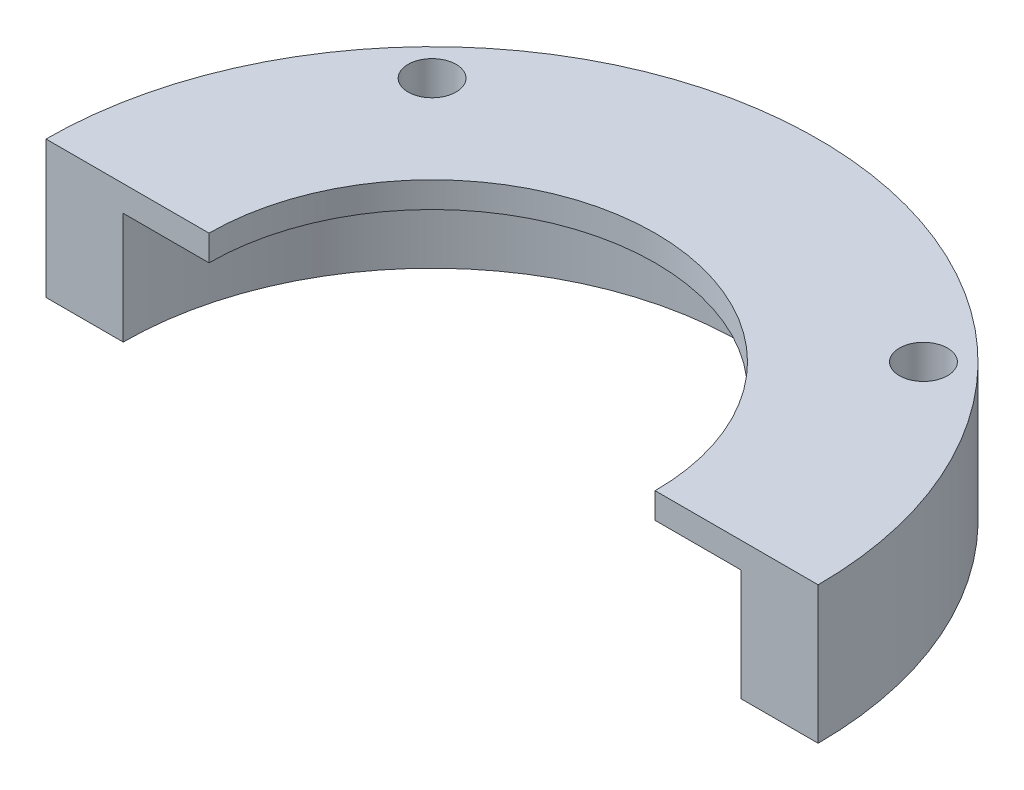
ISO-10303-21;
HEADER;
FILE_DESCRIPTION(('STEP AP214'),'2;1');
FILE_NAME('part.step','',(''),(''),'','','');
FILE_SCHEMA(('AUTOMOTIVE_DESIGN { 1 0 10303 214 1 1 1 1 }'));
ENDSEC;
DATA;
#1=APPLICATION_CONTEXT('core data for automotive mechanical design processes');
#2=APPLICATION_PROTOCOL_DEFINITION('international standard','automotive_design',2000,#1);
#3=PRODUCT_CONTEXT('',#1,'mechanical');
#4=PRODUCT('Part','Part','',(#3));
#5=PRODUCT_RELATED_PRODUCT_CATEGORY('part','',(#4));
#6=PRODUCT_DEFINITION_FORMATION('','',#4);
#7=PRODUCT_DEFINITION_CONTEXT('part definition',#1,'design');
#8=PRODUCT_DEFINITION('design','',#6,#7);
#9=PRODUCT_DEFINITION_SHAPE('','',#8);
#10=(LENGTH_UNIT() NAMED_UNIT(*) SI_UNIT(.MILLI.,.METRE.));
#11=(NAMED_UNIT(*) PLANE_ANGLE_UNIT() SI_UNIT($,.RADIAN.));
#12=(NAMED_UNIT(*) SI_UNIT($,.STERADIAN.) SOLID_ANGLE_UNIT());
#13=UNCERTAINTY_MEASURE_WITH_UNIT(LENGTH_MEASURE(1.E-05),#10,'distance_accuracy_value','');
#14=(GEOMETRIC_REPRESENTATION_CONTEXT(3) GLOBAL_UNCERTAINTY_ASSIGNED_CONTEXT((#13)) GLOBAL_UNIT_ASSIGNED_CONTEXT((#10,
#11,#12)) REPRESENTATION_CONTEXT('',''));
#15=CARTESIAN_POINT('',(0.,0.,0.));
#16=DIRECTION('',(0.,0.,1.));
#17=DIRECTION('',(1.,0.,0.));
#18=AXIS2_PLACEMENT_3D('',#15,#16,#17);
#19=CARTESIAN_POINT('',(0.,10.16,0.));
#20=DIRECTION('',(0.,-1.,0.));
#21=DIRECTION('',(0.,0.,-1.));
#22=AXIS2_PLACEMENT_3D('',#19,#20,#21);
#23=CYLINDRICAL_SURFACE('',#22,16.51);
#24=CARTESIAN_POINT('',(0.,8.255,0.));
#25=DIRECTION('',(0.,-1.,0.));
#26=DIRECTION('',(0.,0.,-1.));
#27=AXIS2_PLACEMENT_3D('',#24,#25,#26);
#28=CIRCLE('',#27,16.51);
#29=CARTESIAN_POINT('',(16.51,8.255,0.));
#30=VERTEX_POINT('',#29);
#31=CARTESIAN_POINT('',(-16.51,8.255,0.));
#32=VERTEX_POINT('',#31);
#33=EDGE_CURVE('E110',#30,#32,#28,.F.);
#34=ORIENTED_EDGE('',*,*,#33,.F.);
#35=DIRECTION('',(0.,-1.,0.));
#36=VECTOR('',#35,1.);
#37=CARTESIAN_POINT('',(16.51,10.16,0.));
#38=LINE('',#37,#36);
#39=CARTESIAN_POINT('',(16.51,10.16,0.));
#40=VERTEX_POINT('',#39);
#41=EDGE_CURVE('E124',#30,#40,#38,.F.);
#42=ORIENTED_EDGE('',*,*,#41,.T.);
#43=CARTESIAN_POINT('',(0.,10.16,0.));
#44=DIRECTION('',(0.,-1.,0.));
#45=DIRECTION('',(0.,0.,-1.));
#46=AXIS2_PLACEMENT_3D('',#43,#44,#45);
#47=CIRCLE('',#46,16.51);
#48=CARTESIAN_POINT('',(-16.51,10.16,0.));
#49=VERTEX_POINT('',#48);
#50=EDGE_CURVE('E106',#49,#40,#47,.T.);
#51=ORIENTED_EDGE('',*,*,#50,.F.);
#52=DIRECTION('',(0.,-1.,0.));
#53=VECTOR('',#52,1.);
#54=CARTESIAN_POINT('',(-16.51,10.16,0.));
#55=LINE('',#54,#53);
#56=EDGE_CURVE('E127',#49,#32,#55,.T.);
#57=ORIENTED_EDGE('',*,*,#56,.T.);
#58=EDGE_LOOP('',(#34,#42,#51,#57));
#59=FACE_BOUND('',#58,.T.);
#60=ADVANCED_FACE('F34',(#59),#23,.F.);
#61=CARTESIAN_POINT('',(0.,10.16,0.));
#62=DIRECTION('',(0.,-1.,0.));
#63=DIRECTION('',(0.,0.,-1.));
#64=AXIS2_PLACEMENT_3D('',#61,#62,#63);
#65=CYLINDRICAL_SURFACE('',#64,28.575);
#66=CARTESIAN_POINT('',(0.,10.16,0.));
#67=DIRECTION('',(0.,1.,0.));
#68=DIRECTION('',(0.,0.,1.));
#69=AXIS2_PLACEMENT_3D('',#66,#67,#68);
#70=CIRCLE('',#69,28.575);
#71=CARTESIAN_POINT('',(28.575,10.16,0.));
#72=VERTEX_POINT('',#71);
#73=CARTESIAN_POINT('',(-28.575,10.16,0.));
#74=VERTEX_POINT('',#73);
#75=EDGE_CURVE('E101',#72,#74,#70,.T.);
#76=ORIENTED_EDGE('',*,*,#75,.F.);
#77=DIRECTION('',(0.,-1.,0.));
#78=VECTOR('',#77,1.);
#79=CARTESIAN_POINT('',(28.575,10.16,0.));
#80=LINE('',#79,#78);
#81=CARTESIAN_POINT('',(28.575,0.,0.));
#82=VERTEX_POINT('',#81);
#83=EDGE_CURVE('E87',#72,#82,#80,.T.);
#84=ORIENTED_EDGE('',*,*,#83,.T.);
#85=CARTESIAN_POINT('',(0.,0.,0.));
#86=DIRECTION('',(0.,1.,0.));
#87=DIRECTION('',(0.,0.,1.));
#88=AXIS2_PLACEMENT_3D('',#85,#86,#87);
#89=CIRCLE('',#88,28.575);
#90=CARTESIAN_POINT('',(-28.575,0.,0.));
#91=VERTEX_POINT('',#90);
#92=EDGE_CURVE('E99',#82,#91,#89,.T.);
#93=ORIENTED_EDGE('',*,*,#92,.T.);
#94=DIRECTION('',(0.,-1.,0.));
#95=VECTOR('',#94,1.);
#96=CARTESIAN_POINT('',(-28.575,10.16,0.));
#97=LINE('',#96,#95);
#98=EDGE_CURVE('E103',#91,#74,#97,.F.);
#99=ORIENTED_EDGE('',*,*,#98,.T.);
#100=EDGE_LOOP('',(#76,#84,#93,#99));
#101=FACE_BOUND('',#100,.T.);
#102=ADVANCED_FACE('F36',(#101),#65,.T.);
#103=CARTESIAN_POINT('',(0.,10.16,0.));
#104=DIRECTION('',(0.,1.,0.));
#105=DIRECTION('',(0.,0.,1.));
#106=AXIS2_PLACEMENT_3D('',#103,#104,#105);
#107=PLANE('',#106);
#108=CARTESIAN_POINT('',(-18.1850186451651,10.16,-18.185018645165));
#109=DIRECTION('',(0.,1.,0.));
#110=DIRECTION('',(0.,0.,1.));
#111=AXIS2_PLACEMENT_3D('',#108,#109,#110);
#112=CIRCLE('',#111,1.778);
#113=CARTESIAN_POINT('',(-18.1850186451651,10.16,-19.963018645165));
#114=VERTEX_POINT('',#113);
#115=EDGE_CURVE('E141',#114,#114,#112,.F.);
#116=ORIENTED_EDGE('',*,*,#115,.T.);
#117=EDGE_LOOP('',(#116));
#118=FACE_BOUND('',#117,.T.);
#119=CARTESIAN_POINT('',(18.1850186451651,10.16,-18.185018645165));
#120=DIRECTION('',(0.,1.,0.));
#121=DIRECTION('',(0.,0.,1.));
#122=AXIS2_PLACEMENT_3D('',#119,#120,#121);
#123=CIRCLE('',#122,1.778);
#124=CARTESIAN_POINT('',(18.1850186451651,10.16,-19.963018645165));
#125=VERTEX_POINT('',#124);
#126=EDGE_CURVE('E135',#125,#125,#123,.F.);
#127=ORIENTED_EDGE('',*,*,#126,.T.);
#128=EDGE_LOOP('',(#127));
#129=FACE_BOUND('',#128,.T.);
#130=DIRECTION('',(-1.,0.,0.));
#131=VECTOR('',#130,1.);
#132=CARTESIAN_POINT('',(-39.5745102781007,10.16,0.));
#133=LINE('',#132,#131);
#134=EDGE_CURVE('E132',#72,#40,#133,.T.);
#135=ORIENTED_EDGE('',*,*,#134,.F.);
#136=ORIENTED_EDGE('',*,*,#75,.T.);
#137=EDGE_CURVE('E131',#49,#74,#133,.T.);
#138=ORIENTED_EDGE('',*,*,#137,.F.);
#139=ORIENTED_EDGE('',*,*,#50,.T.);
#140=EDGE_LOOP('',(#135,#136,#138,#139));
#141=FACE_BOUND('',#140,.T.);
#142=ADVANCED_FACE('F152',(#118,#129,#141),#107,.T.);
#143=CARTESIAN_POINT('',(0.,0.,0.));
#144=DIRECTION('',(0.,1.,0.));
#145=DIRECTION('',(0.,0.,1.));
#146=AXIS2_PLACEMENT_3D('',#143,#144,#145);
#147=PLANE('',#146);
#148=CARTESIAN_POINT('',(-18.1850186451651,0.,-18.185018645165));
#149=DIRECTION('',(0.,-1.,0.));
#150=DIRECTION('',(0.,0.,-1.));
#151=AXIS2_PLACEMENT_3D('',#148,#149,#150);
#152=CIRCLE('',#151,1.778);
#153=CARTESIAN_POINT('',(-18.1850186451651,0.,-19.963018645165));
#154=VERTEX_POINT('',#153);
#155=EDGE_CURVE('E138',#154,#154,#152,.T.);
#156=ORIENTED_EDGE('',*,*,#155,.F.);
#157=EDGE_LOOP('',(#156));
#158=FACE_BOUND('',#157,.T.);
#159=CARTESIAN_POINT('',(18.1850186451651,0.,-18.185018645165));
#160=DIRECTION('',(0.,-1.,0.));
#161=DIRECTION('',(0.,0.,-1.));
#162=AXIS2_PLACEMENT_3D('',#159,#160,#161);
#163=CIRCLE('',#162,1.778);
#164=CARTESIAN_POINT('',(18.1850186451651,0.,-19.963018645165));
#165=VERTEX_POINT('',#164);
#166=EDGE_CURVE('E133',#165,#165,#163,.T.);
#167=ORIENTED_EDGE('',*,*,#166,.F.);
#168=EDGE_LOOP('',(#167));
#169=FACE_BOUND('',#168,.T.);
#170=ORIENTED_EDGE('',*,*,#92,.F.);
#171=DIRECTION('',(-1.,0.,0.));
#172=VECTOR('',#171,1.);
#173=CARTESIAN_POINT('',(-39.5745102781007,0.,0.));
#174=LINE('',#173,#172);
#175=CARTESIAN_POINT('',(22.86,0.,0.));
#176=VERTEX_POINT('',#175);
#177=EDGE_CURVE('E84',#82,#176,#174,.T.);
#178=ORIENTED_EDGE('',*,*,#177,.T.);
#179=CARTESIAN_POINT('',(0.,0.,0.));
#180=DIRECTION('',(0.,-1.,0.));
#181=DIRECTION('',(0.,0.,-1.));
#182=AXIS2_PLACEMENT_3D('',#179,#180,#181);
#183=CIRCLE('',#182,22.86);
#184=CARTESIAN_POINT('',(-22.86,0.,0.));
#185=VERTEX_POINT('',#184);
#186=EDGE_CURVE('E102',#185,#176,#183,.T.);
#187=ORIENTED_EDGE('',*,*,#186,.F.);
#188=EDGE_CURVE('E49',#185,#91,#174,.T.);
#189=ORIENTED_EDGE('',*,*,#188,.T.);
#190=EDGE_LOOP('',(#170,#178,#187,#189));
#191=FACE_BOUND('',#190,.T.);
#192=ADVANCED_FACE('F105',(#158,#169,#191),#147,.F.);
#193=CARTESIAN_POINT('',(0.,8.255,0.));
#194=DIRECTION('',(0.,-1.,0.));
#195=DIRECTION('',(0.,0.,-1.));
#196=AXIS2_PLACEMENT_3D('',#193,#194,#195);
#197=PLANE('',#196);
#198=DIRECTION('',(1.,0.,0.));
#199=VECTOR('',#198,1.);
#200=CARTESIAN_POINT('',(0.,8.255,0.));
#201=LINE('',#200,#199);
#202=CARTESIAN_POINT('',(-22.86,8.255,0.));
#203=VERTEX_POINT('',#202);
#204=EDGE_CURVE('E93',#203,#32,#201,.T.);
#205=ORIENTED_EDGE('',*,*,#204,.F.);
#206=CARTESIAN_POINT('',(0.,8.255,0.));
#207=DIRECTION('',(0.,-1.,0.));
#208=DIRECTION('',(0.,0.,-1.));
#209=AXIS2_PLACEMENT_3D('',#206,#207,#208);
#210=CIRCLE('',#209,22.86);
#211=CARTESIAN_POINT('',(22.86,8.255,0.));
#212=VERTEX_POINT('',#211);
#213=EDGE_CURVE('E114',#203,#212,#210,.T.);
#214=ORIENTED_EDGE('',*,*,#213,.T.);
#215=EDGE_CURVE('E57',#30,#212,#201,.T.);
#216=ORIENTED_EDGE('',*,*,#215,.F.);
#217=ORIENTED_EDGE('',*,*,#33,.T.);
#218=EDGE_LOOP('',(#205,#214,#216,#217));
#219=FACE_BOUND('',#218,.T.);
#220=ADVANCED_FACE('F151',(#219),#197,.T.);
#221=CARTESIAN_POINT('',(0.,8.255,0.));
#222=DIRECTION('',(0.,-1.,0.));
#223=DIRECTION('',(0.,0.,-1.));
#224=AXIS2_PLACEMENT_3D('',#221,#222,#223);
#225=CYLINDRICAL_SURFACE('',#224,22.86);
#226=ORIENTED_EDGE('',*,*,#186,.T.);
#227=DIRECTION('',(0.,-1.,0.));
#228=VECTOR('',#227,1.);
#229=CARTESIAN_POINT('',(22.86,8.255,0.));
#230=LINE('',#229,#228);
#231=EDGE_CURVE('E11',#176,#212,#230,.F.);
#232=ORIENTED_EDGE('',*,*,#231,.T.);
#233=ORIENTED_EDGE('',*,*,#213,.F.);
#234=DIRECTION('',(0.,-1.,0.));
#235=VECTOR('',#234,1.);
#236=CARTESIAN_POINT('',(-22.86,8.255,0.));
#237=LINE('',#236,#235);
#238=EDGE_CURVE('E42',#203,#185,#237,.T.);
#239=ORIENTED_EDGE('',*,*,#238,.T.);
#240=EDGE_LOOP('',(#226,#232,#233,#239));
#241=FACE_BOUND('',#240,.T.);
#242=ADVANCED_FACE('F117',(#241),#225,.F.);
#243=CARTESIAN_POINT('',(-39.5745102781007,0.,0.));
#244=DIRECTION('',(0.,0.,-1.));
#245=DIRECTION('',(-1.,0.,0.));
#246=AXIS2_PLACEMENT_3D('',#243,#244,#245);
#247=PLANE('',#246);
#248=ORIENTED_EDGE('',*,*,#188,.F.);
#249=ORIENTED_EDGE('',*,*,#238,.F.);
#250=ORIENTED_EDGE('',*,*,#204,.T.);
#251=ORIENTED_EDGE('',*,*,#56,.F.);
#252=ORIENTED_EDGE('',*,*,#137,.T.);
#253=ORIENTED_EDGE('',*,*,#98,.F.);
#254=EDGE_LOOP('',(#248,#249,#250,#251,#252,#253));
#255=FACE_BOUND('',#254,.T.);
#256=ADVANCED_FACE('F165',(#255),#247,.F.);
#257=ORIENTED_EDGE('',*,*,#134,.T.);
#258=ORIENTED_EDGE('',*,*,#41,.F.);
#259=ORIENTED_EDGE('',*,*,#215,.T.);
#260=ORIENTED_EDGE('',*,*,#231,.F.);
#261=ORIENTED_EDGE('',*,*,#177,.F.);
#262=ORIENTED_EDGE('',*,*,#83,.F.);
#263=EDGE_LOOP('',(#257,#258,#259,#260,#261,#262));
#264=FACE_BOUND('',#263,.T.);
#265=ADVANCED_FACE('F86',(#264),#247,.F.);
#266=CARTESIAN_POINT('',(18.1850186451651,10.161,-18.185018645165));
#267=DIRECTION('',(0.,-1.,0.));
#268=DIRECTION('',(0.,0.,-1.));
#269=AXIS2_PLACEMENT_3D('',#266,#267,#268);
#270=CYLINDRICAL_SURFACE('',#269,1.778);
#271=CARTESIAN_POINT('',(18.1850186451651,10.16,-19.963018645165));
#272=CARTESIAN_POINT('',(18.1850186451651,10.0541666666667,-19.963018645165));
#273=CARTESIAN_POINT('',(18.1850186451651,9.94833333333333,-19.963018645165));
#274=CARTESIAN_POINT('',(18.1850186451651,9.73666666666667,-19.963018645165));
#275=CARTESIAN_POINT('',(18.1850186451651,9.63083333333333,-19.963018645165));
#276=CARTESIAN_POINT('',(18.1850186451651,9.41916666666667,-19.963018645165));
#277=CARTESIAN_POINT('',(18.1850186451651,9.31333333333333,-19.963018645165));
#278=CARTESIAN_POINT('',(18.1850186451651,9.10166666666667,-19.963018645165));
#279=CARTESIAN_POINT('',(18.1850186451651,8.99583333333333,-19.963018645165));
#280=CARTESIAN_POINT('',(18.1850186451651,8.78416666666667,-19.963018645165));
#281=CARTESIAN_POINT('',(18.1850186451651,8.67833333333333,-19.963018645165));
#282=CARTESIAN_POINT('',(18.1850186451651,8.46666666666667,-19.963018645165));
#283=CARTESIAN_POINT('',(18.1850186451651,8.36083333333333,-19.963018645165));
#284=CARTESIAN_POINT('',(18.1850186451651,8.14916666666667,-19.963018645165));
#285=CARTESIAN_POINT('',(18.1850186451651,8.04333333333333,-19.963018645165));
#286=CARTESIAN_POINT('',(18.1850186451651,7.83166666666667,-19.963018645165));
#287=CARTESIAN_POINT('',(18.1850186451651,7.72583333333333,-19.963018645165));
#288=CARTESIAN_POINT('',(18.1850186451651,7.51416666666667,-19.963018645165));
#289=CARTESIAN_POINT('',(18.1850186451651,7.40833333333333,-19.963018645165));
#290=CARTESIAN_POINT('',(18.1850186451651,7.19666666666667,-19.963018645165));
#291=CARTESIAN_POINT('',(18.1850186451651,7.09083333333333,-19.963018645165));
#292=CARTESIAN_POINT('',(18.1850186451651,6.87916666666667,-19.963018645165));
#293=CARTESIAN_POINT('',(18.1850186451651,6.77333333333333,-19.963018645165));
#294=CARTESIAN_POINT('',(18.1850186451651,6.56166666666667,-19.963018645165));
#295=CARTESIAN_POINT('',(18.1850186451651,6.45583333333333,-19.963018645165));
#296=CARTESIAN_POINT('',(18.1850186451651,6.24416666666667,-19.963018645165));
#297=CARTESIAN_POINT('',(18.1850186451651,6.13833333333333,-19.963018645165));
#298=CARTESIAN_POINT('',(18.1850186451651,5.92666666666667,-19.963018645165));
#299=CARTESIAN_POINT('',(18.1850186451651,5.82083333333333,-19.963018645165));
#300=CARTESIAN_POINT('',(18.1850186451651,5.60916666666667,-19.963018645165));
#301=CARTESIAN_POINT('',(18.1850186451651,5.50333333333333,-19.963018645165));
#302=CARTESIAN_POINT('',(18.1850186451651,5.29166666666667,-19.963018645165));
#303=CARTESIAN_POINT('',(18.1850186451651,5.18583333333333,-19.963018645165));
#304=CARTESIAN_POINT('',(18.1850186451651,4.97416666666667,-19.963018645165));
#305=CARTESIAN_POINT('',(18.1850186451651,4.86833333333333,-19.963018645165));
#306=CARTESIAN_POINT('',(18.1850186451651,4.65666666666667,-19.963018645165));
#307=CARTESIAN_POINT('',(18.1850186451651,4.55083333333334,-19.963018645165));
#308=CARTESIAN_POINT('',(18.1850186451651,4.33916666666667,-19.963018645165));
#309=CARTESIAN_POINT('',(18.1850186451651,4.23333333333333,-19.963018645165));
#310=CARTESIAN_POINT('',(18.1850186451651,4.02166666666667,-19.963018645165));
#311=CARTESIAN_POINT('',(18.1850186451651,3.91583333333333,-19.963018645165));
#312=CARTESIAN_POINT('',(18.1850186451651,3.70416666666667,-19.963018645165));
#313=CARTESIAN_POINT('',(18.1850186451651,3.59833333333333,-19.963018645165));
#314=CARTESIAN_POINT('',(18.1850186451651,3.38666666666667,-19.963018645165));
#315=CARTESIAN_POINT('',(18.1850186451651,3.28083333333333,-19.963018645165));
#316=CARTESIAN_POINT('',(18.1850186451651,3.06916666666667,-19.963018645165));
#317=CARTESIAN_POINT('',(18.1850186451651,2.96333333333333,-19.963018645165));
#318=CARTESIAN_POINT('',(18.1850186451651,2.75166666666667,-19.963018645165));
#319=CARTESIAN_POINT('',(18.1850186451651,2.64583333333333,-19.963018645165));
#320=CARTESIAN_POINT('',(18.1850186451651,2.43416666666667,-19.963018645165));
#321=CARTESIAN_POINT('',(18.1850186451651,2.32833333333334,-19.963018645165));
#322=CARTESIAN_POINT('',(18.1850186451651,2.11666666666667,-19.963018645165));
#323=CARTESIAN_POINT('',(18.1850186451651,2.01083333333334,-19.963018645165));
#324=CARTESIAN_POINT('',(18.1850186451651,1.79916666666667,-19.963018645165));
#325=CARTESIAN_POINT('',(18.1850186451651,1.69333333333334,-19.963018645165));
#326=CARTESIAN_POINT('',(18.1850186451651,1.48166666666667,-19.963018645165));
#327=CARTESIAN_POINT('',(18.1850186451651,1.37583333333334,-19.963018645165));
#328=CARTESIAN_POINT('',(18.1850186451651,1.16416666666667,-19.963018645165));
#329=CARTESIAN_POINT('',(18.1850186451651,1.05833333333334,-19.963018645165));
#330=CARTESIAN_POINT('',(18.1850186451651,0.84666666666667,-19.963018645165));
#331=CARTESIAN_POINT('',(18.1850186451651,0.740833333333336,-19.963018645165));
#332=CARTESIAN_POINT('',(18.1850186451651,0.529166666666669,-19.963018645165));
#333=CARTESIAN_POINT('',(18.1850186451651,0.423333333333336,-19.963018645165));
#334=CARTESIAN_POINT('',(18.1850186451651,0.21166666666667,-19.963018645165));
#335=CARTESIAN_POINT('',(18.1850186451651,0.105833333333336,-19.963018645165));
#336=CARTESIAN_POINT('',(18.1850186451651,0.,-19.963018645165));
#337=B_SPLINE_CURVE_WITH_KNOTS('',3,(#271,#272,#273,#274,#275,#276,#277,#278,#279,#280,#281,
#282,#283,#284,#285,#286,#287,#288,#289,#290,#291,#292,#293,#294,#295,#296,#297,#298,#299,#300,
#301,#302,#303,#304,#305,#306,#307,#308,#309,#310,#311,#312,#313,#314,#315,#316,#317,#318,#319,
#320,#321,#322,#323,#324,#325,#326,#327,#328,#329,#330,#331,#332,#333,#334,#335,#336),
.UNSPECIFIED.,.F.,.F.,(4,2,2,2,2,2,2,2,2,2,2,2,2,2,2,2,2,2,2,2,2,2,2,2,2,2,2,2,2,2,2,2,4),(0.,
0.3175,0.635,0.9525,1.27,1.5875,1.905,2.2225,2.54,2.8575,3.175,3.4925,3.81,4.1275,4.445,4.7625,
5.08,5.3975,5.715,6.0325,6.35,6.6675,6.985,7.3025,7.62,7.9375,8.255,8.5725,8.89,9.2075,9.525,
9.8425,10.16),.UNSPECIFIED.);
#338=EDGE_CURVE('BSEAM155',#125,#165,#337,.T.);
#339=ORIENTED_EDGE('',*,*,#126,.F.);
#340=ORIENTED_EDGE('',*,*,#166,.T.);
#341=ORIENTED_EDGE('',*,*,#338,.T.);
#342=ORIENTED_EDGE('',*,*,#338,.F.);
#343=EDGE_LOOP('',(#339,#341,#340,#342));
#344=FACE_BOUND('',#343,.T.);
#345=ADVANCED_FACE('F155',(#344),#270,.F.);
#346=CARTESIAN_POINT('',(-18.1850186451651,10.161,-18.185018645165));
#347=DIRECTION('',(0.,-1.,0.));
#348=DIRECTION('',(0.,0.,-1.));
#349=AXIS2_PLACEMENT_3D('',#346,#347,#348);
#350=CYLINDRICAL_SURFACE('',#349,1.778);
#351=CARTESIAN_POINT('',(-18.1850186451651,10.16,-19.963018645165));
#352=CARTESIAN_POINT('',(-18.1850186451651,10.0541666666667,-19.963018645165));
#353=CARTESIAN_POINT('',(-18.1850186451651,9.94833333333333,-19.963018645165));
#354=CARTESIAN_POINT('',(-18.1850186451651,9.73666666666667,-19.963018645165));
#355=CARTESIAN_POINT('',(-18.1850186451651,9.63083333333333,-19.963018645165));
#356=CARTESIAN_POINT('',(-18.1850186451651,9.41916666666667,-19.963018645165));
#357=CARTESIAN_POINT('',(-18.1850186451651,9.31333333333333,-19.963018645165));
#358=CARTESIAN_POINT('',(-18.1850186451651,9.10166666666667,-19.963018645165));
#359=CARTESIAN_POINT('',(-18.1850186451651,8.99583333333333,-19.963018645165));
#360=CARTESIAN_POINT('',(-18.1850186451651,8.78416666666667,-19.963018645165));
#361=CARTESIAN_POINT('',(-18.1850186451651,8.67833333333333,-19.963018645165));
#362=CARTESIAN_POINT('',(-18.1850186451651,8.46666666666667,-19.963018645165));
#363=CARTESIAN_POINT('',(-18.1850186451651,8.36083333333333,-19.963018645165));
#364=CARTESIAN_POINT('',(-18.1850186451651,8.14916666666667,-19.963018645165));
#365=CARTESIAN_POINT('',(-18.1850186451651,8.04333333333333,-19.963018645165));
#366=CARTESIAN_POINT('',(-18.1850186451651,7.83166666666667,-19.963018645165));
#367=CARTESIAN_POINT('',(-18.1850186451651,7.72583333333333,-19.963018645165));
#368=CARTESIAN_POINT('',(-18.1850186451651,7.51416666666667,-19.963018645165));
#369=CARTESIAN_POINT('',(-18.1850186451651,7.40833333333333,-19.963018645165));
#370=CARTESIAN_POINT('',(-18.1850186451651,7.19666666666667,-19.963018645165));
#371=CARTESIAN_POINT('',(-18.1850186451651,7.09083333333333,-19.963018645165));
#372=CARTESIAN_POINT('',(-18.1850186451651,6.87916666666667,-19.963018645165));
#373=CARTESIAN_POINT('',(-18.1850186451651,6.77333333333333,-19.963018645165));
#374=CARTESIAN_POINT('',(-18.1850186451651,6.56166666666667,-19.963018645165));
#375=CARTESIAN_POINT('',(-18.1850186451651,6.45583333333333,-19.963018645165));
#376=CARTESIAN_POINT('',(-18.1850186451651,6.24416666666667,-19.963018645165));
#377=CARTESIAN_POINT('',(-18.1850186451651,6.13833333333333,-19.963018645165));
#378=CARTESIAN_POINT('',(-18.1850186451651,5.92666666666667,-19.963018645165));
#379=CARTESIAN_POINT('',(-18.1850186451651,5.82083333333333,-19.963018645165));
#380=CARTESIAN_POINT('',(-18.1850186451651,5.60916666666667,-19.963018645165));
#381=CARTESIAN_POINT('',(-18.1850186451651,5.50333333333333,-19.963018645165));
#382=CARTESIAN_POINT('',(-18.1850186451651,5.29166666666667,-19.963018645165));
#383=CARTESIAN_POINT('',(-18.1850186451651,5.18583333333333,-19.963018645165));
#384=CARTESIAN_POINT('',(-18.1850186451651,4.97416666666667,-19.963018645165));
#385=CARTESIAN_POINT('',(-18.1850186451651,4.86833333333333,-19.963018645165));
#386=CARTESIAN_POINT('',(-18.1850186451651,4.65666666666667,-19.963018645165));
#387=CARTESIAN_POINT('',(-18.1850186451651,4.55083333333334,-19.963018645165));
#388=CARTESIAN_POINT('',(-18.1850186451651,4.33916666666667,-19.963018645165));
#389=CARTESIAN_POINT('',(-18.1850186451651,4.23333333333333,-19.963018645165));
#390=CARTESIAN_POINT('',(-18.1850186451651,4.02166666666667,-19.963018645165));
#391=CARTESIAN_POINT('',(-18.1850186451651,3.91583333333333,-19.963018645165));
#392=CARTESIAN_POINT('',(-18.1850186451651,3.70416666666667,-19.963018645165));
#393=CARTESIAN_POINT('',(-18.1850186451651,3.59833333333333,-19.963018645165));
#394=CARTESIAN_POINT('',(-18.1850186451651,3.38666666666667,-19.963018645165));
#395=CARTESIAN_POINT('',(-18.1850186451651,3.28083333333333,-19.963018645165));
#396=CARTESIAN_POINT('',(-18.1850186451651,3.06916666666667,-19.963018645165));
#397=CARTESIAN_POINT('',(-18.1850186451651,2.96333333333333,-19.963018645165));
#398=CARTESIAN_POINT('',(-18.1850186451651,2.75166666666667,-19.963018645165));
#399=CARTESIAN_POINT('',(-18.1850186451651,2.64583333333333,-19.963018645165));
#400=CARTESIAN_POINT('',(-18.1850186451651,2.43416666666667,-19.963018645165));
#401=CARTESIAN_POINT('',(-18.1850186451651,2.32833333333334,-19.963018645165));
#402=CARTESIAN_POINT('',(-18.1850186451651,2.11666666666667,-19.963018645165));
#403=CARTESIAN_POINT('',(-18.1850186451651,2.01083333333334,-19.963018645165));
#404=CARTESIAN_POINT('',(-18.1850186451651,1.79916666666667,-19.963018645165));
#405=CARTESIAN_POINT('',(-18.1850186451651,1.69333333333334,-19.963018645165));
#406=CARTESIAN_POINT('',(-18.1850186451651,1.48166666666667,-19.963018645165));
#407=CARTESIAN_POINT('',(-18.1850186451651,1.37583333333334,-19.963018645165));
#408=CARTESIAN_POINT('',(-18.1850186451651,1.16416666666667,-19.963018645165));
#409=CARTESIAN_POINT('',(-18.1850186451651,1.05833333333334,-19.963018645165));
#410=CARTESIAN_POINT('',(-18.1850186451651,0.84666666666667,-19.963018645165));
#411=CARTESIAN_POINT('',(-18.1850186451651,0.740833333333336,-19.963018645165));
#412=CARTESIAN_POINT('',(-18.1850186451651,0.529166666666669,-19.963018645165));
#413=CARTESIAN_POINT('',(-18.1850186451651,0.423333333333336,-19.963018645165));
#414=CARTESIAN_POINT('',(-18.1850186451651,0.21166666666667,-19.963018645165));
#415=CARTESIAN_POINT('',(-18.1850186451651,0.105833333333336,-19.963018645165));
#416=CARTESIAN_POINT('',(-18.1850186451651,0.,-19.963018645165));
#417=B_SPLINE_CURVE_WITH_KNOTS('',3,(#351,#352,#353,#354,#355,#356,#357,#358,#359,#360,#361,
#362,#363,#364,#365,#366,#367,#368,#369,#370,#371,#372,#373,#374,#375,#376,#377,#378,#379,#380,
#381,#382,#383,#384,#385,#386,#387,#388,#389,#390,#391,#392,#393,#394,#395,#396,#397,#398,#399,
#400,#401,#402,#403,#404,#405,#406,#407,#408,#409,#410,#411,#412,#413,#414,#415,#416),
.UNSPECIFIED.,.F.,.F.,(4,2,2,2,2,2,2,2,2,2,2,2,2,2,2,2,2,2,2,2,2,2,2,2,2,2,2,2,2,2,2,2,4),(0.,
0.3175,0.635,0.9525,1.27,1.5875,1.905,2.2225,2.54,2.8575,3.175,3.4925,3.81,4.1275,4.445,4.7625,
5.08,5.3975,5.715,6.0325,6.35,6.6675,6.985,7.3025,7.62,7.9375,8.255,8.5725,8.89,9.2075,9.525,
9.8425,10.16),.UNSPECIFIED.);
#418=EDGE_CURVE('BSEAM147',#114,#154,#417,.T.);
#419=ORIENTED_EDGE('',*,*,#115,.F.);
#420=ORIENTED_EDGE('',*,*,#155,.T.);
#421=ORIENTED_EDGE('',*,*,#418,.T.);
#422=ORIENTED_EDGE('',*,*,#418,.F.);
#423=EDGE_LOOP('',(#419,#421,#420,#422));
#424=FACE_BOUND('',#423,.T.);
#425=ADVANCED_FACE('F147',(#424),#350,.F.);
#426=CLOSED_SHELL('',(#60,#102,#142,#192,#220,#242,#256,#265,#345,#425));
#427=MANIFOLD_SOLID_BREP('B2',#426);
#428=ADVANCED_BREP_SHAPE_REPRESENTATION('',(#18,#427),#14);
#429=SHAPE_DEFINITION_REPRESENTATION(#9,#428);
ENDSEC;
END-ISO-10303-21;
